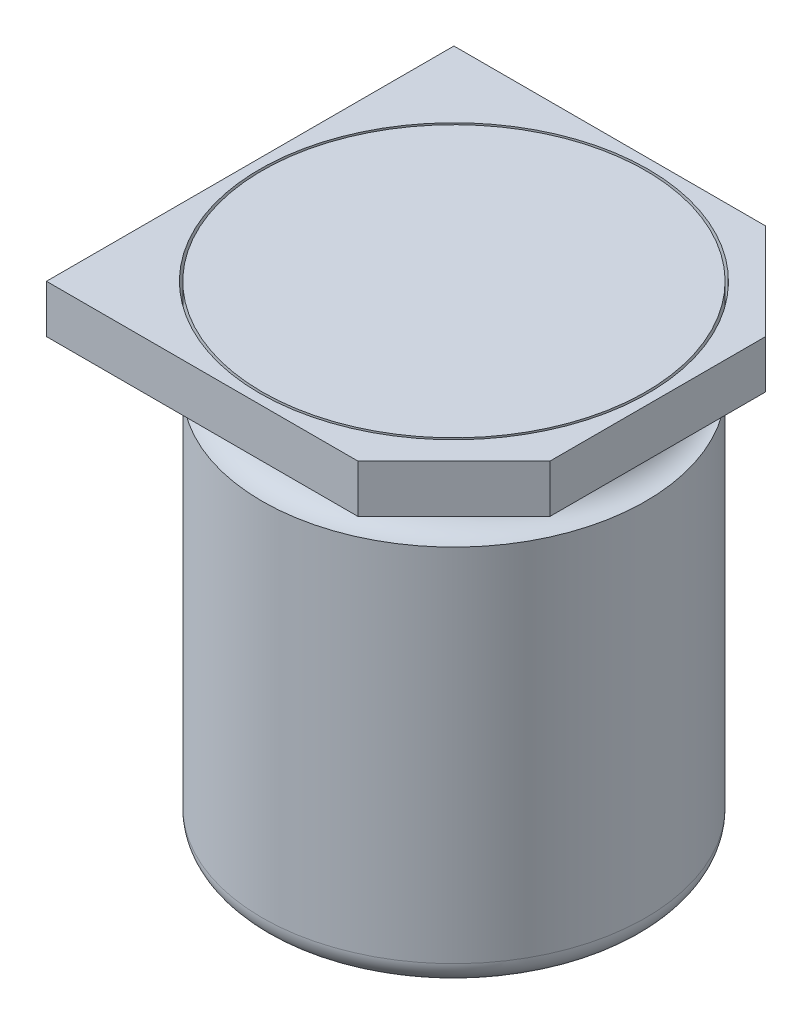
ISO-10303-21;
HEADER;
FILE_DESCRIPTION(('STEP AP214'),'2;1');
FILE_NAME('part.step','',(''),(''),'','','');
FILE_SCHEMA(('AUTOMOTIVE_DESIGN { 1 0 10303 214 1 1 1 1 }'));
ENDSEC;
DATA;
#1=APPLICATION_CONTEXT('core data for automotive mechanical design processes');
#2=APPLICATION_PROTOCOL_DEFINITION('international standard','automotive_design',2000,#1);
#3=PRODUCT_CONTEXT('',#1,'mechanical');
#4=PRODUCT('Part','Part','',(#3));
#5=PRODUCT_RELATED_PRODUCT_CATEGORY('part','',(#4));
#6=PRODUCT_DEFINITION_FORMATION('','',#4);
#7=PRODUCT_DEFINITION_CONTEXT('part definition',#1,'design');
#8=PRODUCT_DEFINITION('design','',#6,#7);
#9=PRODUCT_DEFINITION_SHAPE('','',#8);
#10=(LENGTH_UNIT() NAMED_UNIT(*) SI_UNIT(.MILLI.,.METRE.));
#11=(NAMED_UNIT(*) PLANE_ANGLE_UNIT() SI_UNIT($,.RADIAN.));
#12=(NAMED_UNIT(*) SI_UNIT($,.STERADIAN.) SOLID_ANGLE_UNIT());
#13=UNCERTAINTY_MEASURE_WITH_UNIT(LENGTH_MEASURE(1.E-05),#10,'distance_accuracy_value','');
#14=(GEOMETRIC_REPRESENTATION_CONTEXT(3) GLOBAL_UNCERTAINTY_ASSIGNED_CONTEXT((#13)) GLOBAL_UNIT_ASSIGNED_CONTEXT((#10,
#11,#12)) REPRESENTATION_CONTEXT('',''));
#15=CARTESIAN_POINT('',(0.,0.,0.));
#16=DIRECTION('',(0.,0.,1.));
#17=DIRECTION('',(1.,0.,0.));
#18=AXIS2_PLACEMENT_3D('',#15,#16,#17);
#19=CARTESIAN_POINT('',(0.,0.,0.));
#20=DIRECTION('',(0.,1.,0.));
#21=DIRECTION('',(0.,0.,1.));
#22=AXIS2_PLACEMENT_3D('',#19,#20,#21);
#23=PLANE('',#22);
#24=DIRECTION('',(-1.,0.,0.));
#25=VECTOR('',#24,1.);
#26=CARTESIAN_POINT('',(-4.25,0.,-4.25));
#27=LINE('',#26,#25);
#28=CARTESIAN_POINT('',(-4.25,0.,-4.25));
#29=VERTEX_POINT('',#28);
#30=CARTESIAN_POINT('',(2.25,0.,-4.25));
#31=VERTEX_POINT('',#30);
#32=EDGE_CURVE('P0_E70',#29,#31,#27,.F.);
#33=ORIENTED_EDGE('',*,*,#32,.F.);
#34=DIRECTION('',(0.,0.,1.));
#35=VECTOR('',#34,1.);
#36=CARTESIAN_POINT('',(-4.25,0.,-4.25));
#37=LINE('',#36,#35);
#38=CARTESIAN_POINT('',(-4.25,0.,4.25));
#39=VERTEX_POINT('',#38);
#40=EDGE_CURVE('P0_E65',#39,#29,#37,.F.);
#41=ORIENTED_EDGE('',*,*,#40,.F.);
#42=DIRECTION('',(1.,0.,0.));
#43=VECTOR('',#42,1.);
#44=CARTESIAN_POINT('',(-4.25,0.,4.25));
#45=LINE('',#44,#43);
#46=CARTESIAN_POINT('',(2.25,0.,4.25));
#47=VERTEX_POINT('',#46);
#48=EDGE_CURVE('P0_E114',#47,#39,#45,.F.);
#49=ORIENTED_EDGE('',*,*,#48,.F.);
#50=DIRECTION('',(-0.707106781186548,0.,0.707106781186548));
#51=VECTOR('',#50,1.);
#52=CARTESIAN_POINT('',(2.25,0.,4.25));
#53=LINE('',#52,#51);
#54=CARTESIAN_POINT('',(4.25,0.,2.25));
#55=VERTEX_POINT('',#54);
#56=EDGE_CURVE('P0_E107',#47,#55,#53,.F.);
#57=ORIENTED_EDGE('',*,*,#56,.T.);
#58=DIRECTION('',(0.,0.,-1.));
#59=VECTOR('',#58,1.);
#60=CARTESIAN_POINT('',(4.25,0.,-4.25));
#61=LINE('',#60,#59);
#62=CARTESIAN_POINT('',(4.25,0.,-2.25));
#63=VERTEX_POINT('',#62);
#64=EDGE_CURVE('P0_E84',#63,#55,#61,.F.);
#65=ORIENTED_EDGE('',*,*,#64,.F.);
#66=DIRECTION('',(0.707106781186548,0.,0.707106781186548));
#67=VECTOR('',#66,1.);
#68=CARTESIAN_POINT('',(4.25,0.,-2.25));
#69=LINE('',#68,#67);
#70=EDGE_CURVE('P0_E79',#63,#31,#69,.F.);
#71=ORIENTED_EDGE('',*,*,#70,.T.);
#72=EDGE_LOOP('',(#33,#41,#49,#57,#65,#71));
#73=FACE_BOUND('',#72,.T.);
#74=CARTESIAN_POINT('',(0.,0.,0.));
#75=DIRECTION('',(0.,1.,0.));
#76=DIRECTION('',(0.,0.,1.));
#77=AXIS2_PLACEMENT_3D('',#74,#75,#76);
#78=CIRCLE('',#77,4.05);
#79=CARTESIAN_POINT('',(0.,0.,4.05));
#80=VERTEX_POINT('',#79);
#81=EDGE_CURVE('P0_E19',#80,#80,#78,.F.);
#82=ORIENTED_EDGE('',*,*,#81,.T.);
#83=EDGE_LOOP('',(#82));
#84=FACE_BOUND('',#83,.T.);
#85=ADVANCED_FACE('P0_F16',(#73,#84),#23,.T.);
#86=CARTESIAN_POINT('',(0.,-1.,0.));
#87=DIRECTION('',(0.,1.,0.));
#88=DIRECTION('',(0.,0.,1.));
#89=AXIS2_PLACEMENT_3D('',#86,#87,#88);
#90=CYLINDRICAL_SURFACE('',#89,4.05);
#91=CARTESIAN_POINT('',(0.,-1.,0.));
#92=DIRECTION('',(0.,1.,0.));
#93=DIRECTION('',(0.,0.,1.));
#94=AXIS2_PLACEMENT_3D('',#91,#92,#93);
#95=CIRCLE('',#94,4.05);
#96=CARTESIAN_POINT('',(0.,-1.,4.05));
#97=VERTEX_POINT('',#96);
#98=EDGE_CURVE('P0_E95',#97,#97,#95,.F.);
#99=ORIENTED_EDGE('',*,*,#98,.T.);
#100=EDGE_LOOP('',(#99));
#101=FACE_BOUND('',#100,.T.);
#102=ORIENTED_EDGE('',*,*,#81,.F.);
#103=EDGE_LOOP('',(#102));
#104=FACE_BOUND('',#103,.T.);
#105=ADVANCED_FACE('P0_F189',(#101,#104),#90,.F.);
#106=CARTESIAN_POINT('',(4.25,-1.,-2.25));
#107=DIRECTION('',(-0.707106781186548,0.,0.707106781186548));
#108=DIRECTION('',(0.707106781186548,0.,0.707106781186548));
#109=AXIS2_PLACEMENT_3D('',#106,#107,#108);
#110=PLANE('',#109);
#111=DIRECTION('',(0.,1.,0.));
#112=VECTOR('',#111,1.);
#113=CARTESIAN_POINT('',(2.25,-1.,-4.25));
#114=LINE('',#113,#112);
#115=CARTESIAN_POINT('',(2.25,-1.,-4.25));
#116=VERTEX_POINT('',#115);
#117=EDGE_CURVE('P0_E75',#31,#116,#114,.F.);
#118=ORIENTED_EDGE('',*,*,#117,.F.);
#119=ORIENTED_EDGE('',*,*,#70,.F.);
#120=DIRECTION('',(0.,1.,0.));
#121=VECTOR('',#120,1.);
#122=CARTESIAN_POINT('',(4.25,-1.,-2.25));
#123=LINE('',#122,#121);
#124=CARTESIAN_POINT('',(4.25,-1.,-2.25));
#125=VERTEX_POINT('',#124);
#126=EDGE_CURVE('P0_E97',#125,#63,#123,.T.);
#127=ORIENTED_EDGE('',*,*,#126,.F.);
#128=DIRECTION('',(-0.707106781186548,0.,-0.707106781186548));
#129=VECTOR('',#128,1.);
#130=CARTESIAN_POINT('',(4.25,-1.,-2.25));
#131=LINE('',#130,#129);
#132=EDGE_CURVE('P0_E91',#125,#116,#131,.T.);
#133=ORIENTED_EDGE('',*,*,#132,.T.);
#134=EDGE_LOOP('',(#118,#119,#127,#133));
#135=FACE_BOUND('',#134,.T.);
#136=ADVANCED_FACE('P0_F90',(#135),#110,.F.);
#137=CARTESIAN_POINT('',(-4.25,-1.,-4.25));
#138=DIRECTION('',(0.,0.,-1.));
#139=DIRECTION('',(-1.,0.,0.));
#140=AXIS2_PLACEMENT_3D('',#137,#138,#139);
#141=PLANE('',#140);
#142=DIRECTION('',(1.,0.,0.));
#143=VECTOR('',#142,1.);
#144=CARTESIAN_POINT('',(0.,-1.,-4.25));
#145=LINE('',#144,#143);
#146=CARTESIAN_POINT('',(-4.25,-1.,-4.25));
#147=VERTEX_POINT('',#146);
#148=EDGE_CURVE('P0_E100',#116,#147,#145,.F.);
#149=ORIENTED_EDGE('',*,*,#148,.T.);
#150=DIRECTION('',(0.,1.,0.));
#151=VECTOR('',#150,1.);
#152=CARTESIAN_POINT('',(-4.25,-1.,-4.25));
#153=LINE('',#152,#151);
#154=EDGE_CURVE('P0_E77',#29,#147,#153,.F.);
#155=ORIENTED_EDGE('',*,*,#154,.F.);
#156=ORIENTED_EDGE('',*,*,#32,.T.);
#157=ORIENTED_EDGE('',*,*,#117,.T.);
#158=EDGE_LOOP('',(#149,#155,#156,#157));
#159=FACE_BOUND('',#158,.T.);
#160=ADVANCED_FACE('P0_F73',(#159),#141,.T.);
#161=CARTESIAN_POINT('',(-4.25,-1.,-4.25));
#162=DIRECTION('',(-1.,0.,0.));
#163=DIRECTION('',(0.,0.,1.));
#164=AXIS2_PLACEMENT_3D('',#161,#162,#163);
#165=PLANE('',#164);
#166=DIRECTION('',(0.,0.,1.));
#167=VECTOR('',#166,1.);
#168=CARTESIAN_POINT('',(-4.25,-1.,0.));
#169=LINE('',#168,#167);
#170=CARTESIAN_POINT('',(-4.25,-1.,4.25));
#171=VERTEX_POINT('',#170);
#172=EDGE_CURVE('P0_E118',#147,#171,#169,.T.);
#173=ORIENTED_EDGE('',*,*,#172,.T.);
#174=DIRECTION('',(0.,1.,0.));
#175=VECTOR('',#174,1.);
#176=CARTESIAN_POINT('',(-4.25,-1.,4.25));
#177=LINE('',#176,#175);
#178=EDGE_CURVE('P0_E112',#39,#171,#177,.F.);
#179=ORIENTED_EDGE('',*,*,#178,.F.);
#180=ORIENTED_EDGE('',*,*,#40,.T.);
#181=ORIENTED_EDGE('',*,*,#154,.T.);
#182=EDGE_LOOP('',(#173,#179,#180,#181));
#183=FACE_BOUND('',#182,.T.);
#184=ADVANCED_FACE('P0_F117',(#183),#165,.T.);
#185=CARTESIAN_POINT('',(-4.25,-1.,4.25));
#186=DIRECTION('',(0.,0.,1.));
#187=DIRECTION('',(1.,0.,0.));
#188=AXIS2_PLACEMENT_3D('',#185,#186,#187);
#189=PLANE('',#188);
#190=ORIENTED_EDGE('',*,*,#48,.T.);
#191=ORIENTED_EDGE('',*,*,#178,.T.);
#192=DIRECTION('',(1.,0.,0.));
#193=VECTOR('',#192,1.);
#194=CARTESIAN_POINT('',(0.,-1.,4.25));
#195=LINE('',#194,#193);
#196=CARTESIAN_POINT('',(2.25,-1.,4.25));
#197=VERTEX_POINT('',#196);
#198=EDGE_CURVE('P0_E125',#171,#197,#195,.T.);
#199=ORIENTED_EDGE('',*,*,#198,.T.);
#200=DIRECTION('',(0.,1.,0.));
#201=VECTOR('',#200,1.);
#202=CARTESIAN_POINT('',(2.25,-1.,4.25));
#203=LINE('',#202,#201);
#204=EDGE_CURVE('P0_E109',#197,#47,#203,.T.);
#205=ORIENTED_EDGE('',*,*,#204,.T.);
#206=EDGE_LOOP('',(#190,#191,#199,#205));
#207=FACE_BOUND('',#206,.T.);
#208=ADVANCED_FACE('P0_F134',(#207),#189,.T.);
#209=CARTESIAN_POINT('',(2.25,-1.,4.25));
#210=DIRECTION('',(-0.707106781186548,0.,-0.707106781186548));
#211=DIRECTION('',(-0.707106781186548,0.,0.707106781186548));
#212=AXIS2_PLACEMENT_3D('',#209,#210,#211);
#213=PLANE('',#212);
#214=DIRECTION('',(0.,1.,0.));
#215=VECTOR('',#214,1.);
#216=CARTESIAN_POINT('',(4.25,-1.,2.25));
#217=LINE('',#216,#215);
#218=CARTESIAN_POINT('',(4.25,-1.,2.25));
#219=VERTEX_POINT('',#218);
#220=EDGE_CURVE('P0_E33',#55,#219,#217,.F.);
#221=ORIENTED_EDGE('',*,*,#220,.F.);
#222=ORIENTED_EDGE('',*,*,#56,.F.);
#223=ORIENTED_EDGE('',*,*,#204,.F.);
#224=DIRECTION('',(0.707106781186548,0.,-0.707106781186548));
#225=VECTOR('',#224,1.);
#226=CARTESIAN_POINT('',(2.25,-1.,4.25));
#227=LINE('',#226,#225);
#228=EDGE_CURVE('P0_E25',#197,#219,#227,.T.);
#229=ORIENTED_EDGE('',*,*,#228,.T.);
#230=EDGE_LOOP('',(#221,#222,#223,#229));
#231=FACE_BOUND('',#230,.T.);
#232=ADVANCED_FACE('P0_F131',(#231),#213,.F.);
#233=CARTESIAN_POINT('',(4.25,-1.,-4.25));
#234=DIRECTION('',(1.,0.,0.));
#235=DIRECTION('',(0.,0.,-1.));
#236=AXIS2_PLACEMENT_3D('',#233,#234,#235);
#237=PLANE('',#236);
#238=DIRECTION('',(0.,0.,1.));
#239=VECTOR('',#238,1.);
#240=CARTESIAN_POINT('',(4.25,-1.,0.));
#241=LINE('',#240,#239);
#242=EDGE_CURVE('P0_E11',#219,#125,#241,.F.);
#243=ORIENTED_EDGE('',*,*,#242,.T.);
#244=ORIENTED_EDGE('',*,*,#126,.T.);
#245=ORIENTED_EDGE('',*,*,#64,.T.);
#246=ORIENTED_EDGE('',*,*,#220,.T.);
#247=EDGE_LOOP('',(#243,#244,#245,#246));
#248=FACE_BOUND('',#247,.T.);
#249=ADVANCED_FACE('P0_F142',(#248),#237,.T.);
#250=CARTESIAN_POINT('',(0.,-1.,0.));
#251=DIRECTION('',(0.,1.,0.));
#252=DIRECTION('',(0.,0.,1.));
#253=AXIS2_PLACEMENT_3D('',#250,#251,#252);
#254=PLANE('',#253);
#255=ORIENTED_EDGE('',*,*,#228,.F.);
#256=ORIENTED_EDGE('',*,*,#198,.F.);
#257=ORIENTED_EDGE('',*,*,#172,.F.);
#258=ORIENTED_EDGE('',*,*,#148,.F.);
#259=ORIENTED_EDGE('',*,*,#132,.F.);
#260=ORIENTED_EDGE('',*,*,#242,.F.);
#261=EDGE_LOOP('',(#255,#256,#257,#258,#259,#260));
#262=FACE_BOUND('',#261,.T.);
#263=ORIENTED_EDGE('',*,*,#98,.F.);
#264=EDGE_LOOP('',(#263));
#265=FACE_BOUND('',#264,.T.);
#266=ADVANCED_FACE('P0_F122',(#262,#265),#254,.F.);
#267=CLOSED_SHELL('',(#85,#105,#136,#160,#184,#208,#232,#249,#266));
#268=MANIFOLD_SOLID_BREP('P0_B1',#267);
#269=CARTESIAN_POINT('',(0.,0.,0.));
#270=DIRECTION('',(0.,1.,0.));
#271=DIRECTION('',(0.,0.,1.));
#272=AXIS2_PLACEMENT_3D('',#269,#270,#271);
#273=PLANE('',#272);
#274=CARTESIAN_POINT('',(0.,0.,0.));
#275=DIRECTION('',(0.,1.,0.));
#276=DIRECTION('',(0.,0.,1.));
#277=AXIS2_PLACEMENT_3D('',#274,#275,#276);
#278=CIRCLE('',#277,4.);
#279=CARTESIAN_POINT('',(0.,0.,4.));
#280=VERTEX_POINT('',#279);
#281=EDGE_CURVE('P1_E63',#280,#280,#278,.F.);
#282=ORIENTED_EDGE('',*,*,#281,.F.);
#283=EDGE_LOOP('',(#282));
#284=FACE_BOUND('',#283,.T.);
#285=ADVANCED_FACE('P1_F15',(#284),#273,.T.);
#286=CARTESIAN_POINT('',(0.,-9.99,0.));
#287=DIRECTION('',(0.,-1.,0.));
#288=DIRECTION('',(0.,0.,-1.));
#289=AXIS2_PLACEMENT_3D('',#286,#287,#288);
#290=PLANE('',#289);
#291=CARTESIAN_POINT('',(0.,-9.99,0.));
#292=DIRECTION('',(0.,-1.,0.));
#293=DIRECTION('',(0.,0.,-1.));
#294=AXIS2_PLACEMENT_3D('',#291,#292,#293);
#295=CIRCLE('',#294,3.5);
#296=CARTESIAN_POINT('',(-1.50000000000007,-9.99,3.16227766016834));
#297=VERTEX_POINT('',#296);
#298=CARTESIAN_POINT('',(-1.50000000000007,-9.99,-3.16227766016834));
#299=VERTEX_POINT('',#298);
#300=EDGE_CURVE('P1_E53',#297,#299,#295,.T.);
#301=ORIENTED_EDGE('',*,*,#300,.T.);
#302=DIRECTION('',(0.,0.,-1.));
#303=VECTOR('',#302,1.);
#304=CARTESIAN_POINT('',(-1.5,-9.99,3.162277660168));
#305=LINE('',#304,#303);
#306=EDGE_CURVE('P1_E50',#299,#297,#305,.F.);
#307=ORIENTED_EDGE('',*,*,#306,.T.);
#308=EDGE_LOOP('',(#301,#307));
#309=FACE_BOUND('',#308,.T.);
#310=ADVANCED_FACE('P1_F54',(#309),#290,.T.);
#311=CARTESIAN_POINT('',(-1.5,-9.99,3.162277660168));
#312=DIRECTION('',(1.,0.,0.));
#313=DIRECTION('',(0.,0.,-1.));
#314=AXIS2_PLACEMENT_3D('',#311,#312,#313);
#315=PLANE('',#314);
#316=DIRECTION('',(0.,-1.,0.));
#317=VECTOR('',#316,1.);
#318=CARTESIAN_POINT('',(-1.50000000000015,-9.99,3.16227766016831));
#319=LINE('',#318,#317);
#320=CARTESIAN_POINT('',(-1.50000000000003,-10.,3.16227766016806));
#321=VERTEX_POINT('',#320);
#322=EDGE_CURVE('P1_E59',#321,#297,#319,.F.);
#323=ORIENTED_EDGE('',*,*,#322,.T.);
#324=ORIENTED_EDGE('',*,*,#306,.F.);
#325=DIRECTION('',(0.,-1.,0.));
#326=VECTOR('',#325,1.);
#327=CARTESIAN_POINT('',(-1.50000000000015,-9.99,-3.16227766016831));
#328=LINE('',#327,#326);
#329=CARTESIAN_POINT('',(-1.50000000000006,-10.,-3.16227766016812));
#330=VERTEX_POINT('',#329);
#331=EDGE_CURVE('P1_E58',#299,#330,#328,.T.);
#332=ORIENTED_EDGE('',*,*,#331,.T.);
#333=DIRECTION('',(0.,0.,-1.));
#334=VECTOR('',#333,1.);
#335=CARTESIAN_POINT('',(-1.5,-10.,0.));
#336=LINE('',#335,#334);
#337=EDGE_CURVE('P1_E69',#321,#330,#336,.T.);
#338=ORIENTED_EDGE('',*,*,#337,.F.);
#339=EDGE_LOOP('',(#323,#324,#332,#338));
#340=FACE_BOUND('',#339,.T.);
#341=ADVANCED_FACE('P1_F62',(#340),#315,.F.);
#342=CARTESIAN_POINT('',(0.,-10.,0.));
#343=DIRECTION('',(0.,1.,0.));
#344=DIRECTION('',(0.,0.,1.));
#345=AXIS2_PLACEMENT_3D('',#342,#343,#344);
#346=CYLINDRICAL_SURFACE('',#345,4.);
#347=ORIENTED_EDGE('',*,*,#281,.T.);
#348=EDGE_LOOP('',(#347));
#349=FACE_BOUND('',#348,.T.);
#350=CARTESIAN_POINT('',(0.,-0.848148512986,0.));
#351=DIRECTION('',(0.,1.,0.));
#352=DIRECTION('',(0.,0.,1.));
#353=AXIS2_PLACEMENT_3D('',#350,#351,#352);
#354=CIRCLE('',#353,4.);
#355=CARTESIAN_POINT('',(0.,-0.848148512986,4.));
#356=VERTEX_POINT('',#355);
#357=EDGE_CURVE('P1_E71',#356,#356,#354,.T.);
#358=ORIENTED_EDGE('',*,*,#357,.T.);
#359=EDGE_LOOP('',(#358));
#360=FACE_BOUND('',#359,.T.);
#361=ADVANCED_FACE('P1_F173',(#349,#360),#346,.T.);
#362=CARTESIAN_POINT('',(0.,-9.99,0.));
#363=DIRECTION('',(0.,-1.,0.));
#364=DIRECTION('',(0.,0.,-1.));
#365=AXIS2_PLACEMENT_3D('',#362,#363,#364);
#366=CYLINDRICAL_SURFACE('',#365,3.5);
#367=ORIENTED_EDGE('',*,*,#331,.F.);
#368=ORIENTED_EDGE('',*,*,#300,.F.);
#369=ORIENTED_EDGE('',*,*,#322,.F.);
#370=CARTESIAN_POINT('',(0.,-10.,0.));
#371=DIRECTION('',(0.,1.,0.));
#372=DIRECTION('',(0.,0.,1.));
#373=AXIS2_PLACEMENT_3D('',#370,#371,#372);
#374=CIRCLE('',#373,3.49999999999966);
#375=EDGE_CURVE('P1_E68',#330,#321,#374,.T.);
#376=ORIENTED_EDGE('',*,*,#375,.F.);
#377=EDGE_LOOP('',(#367,#368,#369,#376));
#378=FACE_BOUND('',#377,.T.);
#379=ADVANCED_FACE('P1_F66',(#378),#366,.F.);
#380=CARTESIAN_POINT('',(3.5,-10.,0.));
#381=DIRECTION('',(0.,-1.,0.));
#382=DIRECTION('',(0.,0.,-1.));
#383=AXIS2_PLACEMENT_3D('',#380,#381,#382);
#384=PLANE('',#383);
#385=CARTESIAN_POINT('',(0.,-10.,0.));
#386=DIRECTION('',(0.,1.,0.));
#387=DIRECTION('',(0.,0.,1.));
#388=AXIS2_PLACEMENT_3D('',#385,#386,#387);
#389=CIRCLE('',#388,3.49999999999991);
#390=CARTESIAN_POINT('',(0.,-10.,3.4999999999999));
#391=VERTEX_POINT('',#390);
#392=CARTESIAN_POINT('',(0.,-10.,-3.49999999999998));
#393=VERTEX_POINT('',#392);
#394=EDGE_CURVE('P1_E125',#391,#393,#389,.T.);
#395=ORIENTED_EDGE('',*,*,#394,.F.);
#396=CARTESIAN_POINT('',(0.,-10.,0.));
#397=DIRECTION('',(0.,1.,0.));
#398=DIRECTION('',(-0.428571428571471,0.,0.903507902905231));
#399=AXIS2_PLACEMENT_3D('',#396,#397,#398);
#400=CIRCLE('',#399,3.49999999999966);
#401=EDGE_CURVE('P1_E135',#321,#391,#400,.T.);
#402=ORIENTED_EDGE('',*,*,#401,.F.);
#403=ORIENTED_EDGE('',*,*,#337,.T.);
#404=CARTESIAN_POINT('',(0.,-10.,0.));
#405=DIRECTION('',(0.,1.,0.));
#406=DIRECTION('',(0.,0.,-1.));
#407=AXIS2_PLACEMENT_3D('',#404,#405,#406);
#408=CIRCLE('',#407,3.5);
#409=EDGE_CURVE('P1_E35',#393,#330,#408,.T.);
#410=ORIENTED_EDGE('',*,*,#409,.F.);
#411=EDGE_LOOP('',(#395,#402,#403,#410));
#412=FACE_BOUND('',#411,.T.);
#413=ADVANCED_FACE('P1_F102',(#412),#384,.T.);
#414=CARTESIAN_POINT('',(0.,-9.5,0.));
#415=DIRECTION('',(0.,1.,0.));
#416=DIRECTION('',(0.,0.,1.));
#417=AXIS2_PLACEMENT_3D('',#414,#415,#416);
#418=TOROIDAL_SURFACE('',#417,3.5,0.5);
#419=CARTESIAN_POINT('',(0.,-9.5,0.));
#420=DIRECTION('',(0.,1.,0.));
#421=DIRECTION('',(0.,0.,1.));
#422=AXIS2_PLACEMENT_3D('',#419,#420,#421);
#423=CIRCLE('',#422,4.);
#424=CARTESIAN_POINT('',(0.,-9.5,4.));
#425=VERTEX_POINT('',#424);
#426=EDGE_CURVE('P1_E26',#425,#425,#423,.T.);
#427=ORIENTED_EDGE('',*,*,#426,.F.);
#428=EDGE_LOOP('',(#427));
#429=FACE_BOUND('',#428,.T.);
#430=ORIENTED_EDGE('',*,*,#394,.T.);
#431=ORIENTED_EDGE('',*,*,#409,.T.);
#432=ORIENTED_EDGE('',*,*,#375,.T.);
#433=ORIENTED_EDGE('',*,*,#401,.T.);
#434=EDGE_LOOP('',(#430,#431,#432,#433));
#435=FACE_BOUND('',#434,.T.);
#436=ADVANCED_FACE('P1_F90',(#429,#435),#418,.T.);
#437=CARTESIAN_POINT('',(0.,-1.411541064194,0.));
#438=DIRECTION('',(0.,1.,0.));
#439=DIRECTION('',(0.,0.,1.));
#440=AXIS2_PLACEMENT_3D('',#437,#438,#439);
#441=TOROIDAL_SURFACE('',#440,4.,0.563392551208);
#442=ORIENTED_EDGE('',*,*,#357,.F.);
#443=EDGE_LOOP('',(#442));
#444=FACE_BOUND('',#443,.T.);
#445=CARTESIAN_POINT('',(0.,-1.974933615402,0.));
#446=DIRECTION('',(0.,1.,0.));
#447=DIRECTION('',(0.,0.,1.));
#448=AXIS2_PLACEMENT_3D('',#445,#446,#447);
#449=CIRCLE('',#448,4.);
#450=CARTESIAN_POINT('',(0.,-1.974933615402,4.));
#451=VERTEX_POINT('',#450);
#452=EDGE_CURVE('P1_E10',#451,#451,#449,.F.);
#453=ORIENTED_EDGE('',*,*,#452,.F.);
#454=EDGE_LOOP('',(#453));
#455=FACE_BOUND('',#454,.T.);
#456=ADVANCED_FACE('P1_F101',(#444,#455),#441,.F.);
#457=CARTESIAN_POINT('',(0.,-10.,0.));
#458=DIRECTION('',(0.,1.,0.));
#459=DIRECTION('',(0.,0.,1.));
#460=AXIS2_PLACEMENT_3D('',#457,#458,#459);
#461=CYLINDRICAL_SURFACE('',#460,4.);
#462=ORIENTED_EDGE('',*,*,#452,.T.);
#463=EDGE_LOOP('',(#462));
#464=FACE_BOUND('',#463,.T.);
#465=ORIENTED_EDGE('',*,*,#426,.T.);
#466=EDGE_LOOP('',(#465));
#467=FACE_BOUND('',#466,.T.);
#468=ADVANCED_FACE('P1_F159',(#464,#467),#461,.T.);
#469=CLOSED_SHELL('',(#285,#310,#341,#361,#379,#413,#436,#456,#468));
#470=MANIFOLD_SOLID_BREP('P1_B1',#469);
#471=ADVANCED_BREP_SHAPE_REPRESENTATION('',(#18,#268,#470),#14);
#472=SHAPE_DEFINITION_REPRESENTATION(#9,#471);
ENDSEC;
END-ISO-10303-21;
